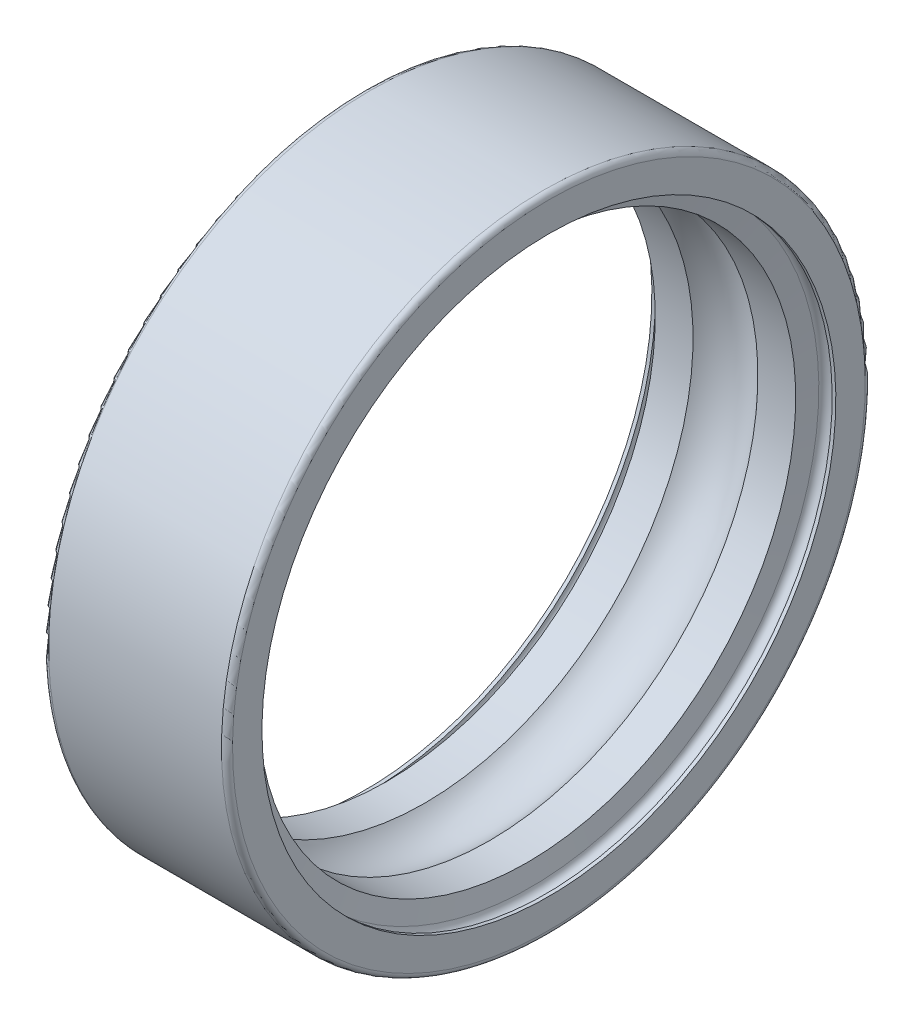
ISO-10303-21;
HEADER;
FILE_DESCRIPTION(('STEP AP214'),'2;1');
FILE_NAME('part.step','',(''),(''),'','','');
FILE_SCHEMA(('AUTOMOTIVE_DESIGN { 1 0 10303 214 1 1 1 1 }'));
ENDSEC;
DATA;
#1=APPLICATION_CONTEXT('core data for automotive mechanical design processes');
#2=APPLICATION_PROTOCOL_DEFINITION('international standard','automotive_design',2000,#1);
#3=PRODUCT_CONTEXT('',#1,'mechanical');
#4=PRODUCT('Part','Part','',(#3));
#5=PRODUCT_RELATED_PRODUCT_CATEGORY('part','',(#4));
#6=PRODUCT_DEFINITION_FORMATION('','',#4);
#7=PRODUCT_DEFINITION_CONTEXT('part definition',#1,'design');
#8=PRODUCT_DEFINITION('design','',#6,#7);
#9=PRODUCT_DEFINITION_SHAPE('','',#8);
#10=(LENGTH_UNIT() NAMED_UNIT(*) SI_UNIT(.MILLI.,.METRE.));
#11=(NAMED_UNIT(*) PLANE_ANGLE_UNIT() SI_UNIT($,.RADIAN.));
#12=(NAMED_UNIT(*) SI_UNIT($,.STERADIAN.) SOLID_ANGLE_UNIT());
#13=UNCERTAINTY_MEASURE_WITH_UNIT(LENGTH_MEASURE(1.E-05),#10,'distance_accuracy_value','');
#14=(GEOMETRIC_REPRESENTATION_CONTEXT(3) GLOBAL_UNCERTAINTY_ASSIGNED_CONTEXT((#13)) GLOBAL_UNIT_ASSIGNED_CONTEXT((#10,
#11,#12)) REPRESENTATION_CONTEXT('',''));
#15=CARTESIAN_POINT('',(0.,0.,0.));
#16=DIRECTION('',(0.,0.,1.));
#17=DIRECTION('',(1.,0.,0.));
#18=AXIS2_PLACEMENT_3D('',#15,#16,#17);
#19=CARTESIAN_POINT('',(9.4,0.,0.));
#20=DIRECTION('',(1.,0.,0.));
#21=DIRECTION('',(0.,0.,-1.));
#22=AXIS2_PLACEMENT_3D('',#19,#20,#21);
#23=TOROIDAL_SURFACE('',#22,15.6,0.4);
#24=CARTESIAN_POINT('',(9.8,0.,0.));
#25=DIRECTION('',(1.,0.,0.));
#26=DIRECTION('',(0.,1.,0.));
#27=AXIS2_PLACEMENT_3D('',#24,#25,#26);
#28=CIRCLE('',#27,15.6);
#29=CARTESIAN_POINT('',(9.8,15.6,0.));
#30=VERTEX_POINT('',#29);
#31=EDGE_CURVE('E11',#30,#30,#28,.T.);
#32=ORIENTED_EDGE('',*,*,#31,.T.);
#33=EDGE_LOOP('',(#32));
#34=FACE_BOUND('',#33,.T.);
#35=CARTESIAN_POINT('',(9.00607689879512,0.,0.));
#36=DIRECTION('',(1.,0.,0.));
#37=DIRECTION('',(0.,1.,0.));
#38=AXIS2_PLACEMENT_3D('',#35,#36,#37);
#39=CIRCLE('',#38,15.6694592710668);
#40=CARTESIAN_POINT('',(9.00607689879512,15.6694592710668,0.));
#41=VERTEX_POINT('',#40);
#42=EDGE_CURVE('E72',#41,#41,#39,.T.);
#43=ORIENTED_EDGE('',*,*,#42,.F.);
#44=EDGE_LOOP('',(#43));
#45=FACE_BOUND('',#44,.T.);
#46=ADVANCED_FACE('F17',(#34,#45),#23,.F.);
#47=CARTESIAN_POINT('',(9.9,0.,0.));
#48=DIRECTION('',(-1.,0.,0.));
#49=DIRECTION('',(0.,1.,0.));
#50=AXIS2_PLACEMENT_3D('',#47,#48,#49);
#51=CYLINDRICAL_SURFACE('',#50,15.6);
#52=CARTESIAN_POINT('',(10.,0.,0.));
#53=DIRECTION('',(1.,0.,0.));
#54=DIRECTION('',(0.,1.,0.));
#55=AXIS2_PLACEMENT_3D('',#52,#53,#54);
#56=CIRCLE('',#55,15.6);
#57=CARTESIAN_POINT('',(10.,15.6,0.));
#58=VERTEX_POINT('',#57);
#59=EDGE_CURVE('E26',#58,#58,#56,.T.);
#60=ORIENTED_EDGE('',*,*,#59,.T.);
#61=EDGE_LOOP('',(#60));
#62=FACE_BOUND('',#61,.T.);
#63=ORIENTED_EDGE('',*,*,#31,.F.);
#64=EDGE_LOOP('',(#63));
#65=FACE_BOUND('',#64,.T.);
#66=ADVANCED_FACE('F118',(#62,#65),#51,.F.);
#67=CARTESIAN_POINT('',(10.,16.4,0.));
#68=DIRECTION('',(1.,0.,0.));
#69=DIRECTION('',(0.,1.,0.));
#70=AXIS2_PLACEMENT_3D('',#67,#68,#69);
#71=PLANE('',#70);
#72=CARTESIAN_POINT('',(10.,0.,0.));
#73=DIRECTION('',(1.,0.,0.));
#74=DIRECTION('',(0.,1.,0.));
#75=AXIS2_PLACEMENT_3D('',#72,#73,#74);
#76=CIRCLE('',#75,17.2);
#77=CARTESIAN_POINT('',(10.,17.2,0.));
#78=VERTEX_POINT('',#77);
#79=EDGE_CURVE('E78',#78,#78,#76,.T.);
#80=ORIENTED_EDGE('',*,*,#79,.T.);
#81=EDGE_LOOP('',(#80));
#82=FACE_BOUND('',#81,.T.);
#83=ORIENTED_EDGE('',*,*,#59,.F.);
#84=EDGE_LOOP('',(#83));
#85=FACE_BOUND('',#84,.T.);
#86=ADVANCED_FACE('F122',(#82,#85),#71,.T.);
#87=CARTESIAN_POINT('',(9.7,0.,0.));
#88=DIRECTION('',(1.,0.,0.));
#89=DIRECTION('',(0.,0.,-1.));
#90=AXIS2_PLACEMENT_3D('',#87,#88,#89);
#91=TOROIDAL_SURFACE('',#90,17.2,0.3);
#92=CARTESIAN_POINT('',(9.7,0.,0.));
#93=DIRECTION('',(1.,0.,0.));
#94=DIRECTION('',(0.,1.,0.));
#95=AXIS2_PLACEMENT_3D('',#92,#93,#94);
#96=CIRCLE('',#95,17.5);
#97=CARTESIAN_POINT('',(9.7,17.5,0.));
#98=VERTEX_POINT('',#97);
#99=EDGE_CURVE('E80',#98,#98,#96,.T.);
#100=ORIENTED_EDGE('',*,*,#99,.T.);
#101=EDGE_LOOP('',(#100));
#102=FACE_BOUND('',#101,.T.);
#103=ORIENTED_EDGE('',*,*,#79,.F.);
#104=EDGE_LOOP('',(#103));
#105=FACE_BOUND('',#104,.T.);
#106=ADVANCED_FACE('F135',(#102,#105),#91,.T.);
#107=CARTESIAN_POINT('',(5.,0.,0.));
#108=DIRECTION('',(-1.,0.,0.));
#109=DIRECTION('',(0.,1.,0.));
#110=AXIS2_PLACEMENT_3D('',#107,#108,#109);
#111=CYLINDRICAL_SURFACE('',#110,17.5);
#112=CARTESIAN_POINT('',(0.3,0.,0.));
#113=DIRECTION('',(1.,0.,0.));
#114=DIRECTION('',(0.,1.,0.));
#115=AXIS2_PLACEMENT_3D('',#112,#113,#114);
#116=CIRCLE('',#115,17.5);
#117=CARTESIAN_POINT('',(0.3,17.5,0.));
#118=VERTEX_POINT('',#117);
#119=EDGE_CURVE('E82',#118,#118,#116,.T.);
#120=ORIENTED_EDGE('',*,*,#119,.T.);
#121=EDGE_LOOP('',(#120));
#122=FACE_BOUND('',#121,.T.);
#123=ORIENTED_EDGE('',*,*,#99,.F.);
#124=EDGE_LOOP('',(#123));
#125=FACE_BOUND('',#124,.T.);
#126=ADVANCED_FACE('F138',(#122,#125),#111,.T.);
#127=CARTESIAN_POINT('',(0.3,0.,0.));
#128=DIRECTION('',(1.,0.,0.));
#129=DIRECTION('',(0.,0.,-1.));
#130=AXIS2_PLACEMENT_3D('',#127,#128,#129);
#131=TOROIDAL_SURFACE('',#130,17.2,0.3);
#132=CARTESIAN_POINT('',(0.,0.,0.));
#133=DIRECTION('',(1.,0.,0.));
#134=DIRECTION('',(0.,1.,0.));
#135=AXIS2_PLACEMENT_3D('',#132,#133,#134);
#136=CIRCLE('',#135,17.2);
#137=CARTESIAN_POINT('',(0.,17.2,0.));
#138=VERTEX_POINT('',#137);
#139=EDGE_CURVE('E90',#138,#138,#136,.T.);
#140=ORIENTED_EDGE('',*,*,#139,.T.);
#141=EDGE_LOOP('',(#140));
#142=FACE_BOUND('',#141,.T.);
#143=ORIENTED_EDGE('',*,*,#119,.F.);
#144=EDGE_LOOP('',(#143));
#145=FACE_BOUND('',#144,.T.);
#146=ADVANCED_FACE('F147',(#142,#145),#131,.T.);
#147=CARTESIAN_POINT('',(0.,16.4,0.));
#148=DIRECTION('',(-1.,0.,0.));
#149=DIRECTION('',(0.,-1.,0.));
#150=AXIS2_PLACEMENT_3D('',#147,#148,#149);
#151=PLANE('',#150);
#152=CARTESIAN_POINT('',(0.,0.,0.));
#153=DIRECTION('',(1.,0.,0.));
#154=DIRECTION('',(0.,1.,0.));
#155=AXIS2_PLACEMENT_3D('',#152,#153,#154);
#156=CIRCLE('',#155,15.6);
#157=CARTESIAN_POINT('',(0.,15.6,0.));
#158=VERTEX_POINT('',#157);
#159=EDGE_CURVE('E85',#158,#158,#156,.T.);
#160=ORIENTED_EDGE('',*,*,#159,.T.);
#161=EDGE_LOOP('',(#160));
#162=FACE_BOUND('',#161,.T.);
#163=ORIENTED_EDGE('',*,*,#139,.F.);
#164=EDGE_LOOP('',(#163));
#165=FACE_BOUND('',#164,.T.);
#166=ADVANCED_FACE('F145',(#162,#165),#151,.T.);
#167=CARTESIAN_POINT('',(0.1,0.,0.));
#168=DIRECTION('',(-1.,0.,0.));
#169=DIRECTION('',(0.,1.,0.));
#170=AXIS2_PLACEMENT_3D('',#167,#168,#169);
#171=CYLINDRICAL_SURFACE('',#170,15.6);
#172=CARTESIAN_POINT('',(0.2,0.,0.));
#173=DIRECTION('',(1.,0.,0.));
#174=DIRECTION('',(0.,1.,0.));
#175=AXIS2_PLACEMENT_3D('',#172,#173,#174);
#176=CIRCLE('',#175,15.6);
#177=CARTESIAN_POINT('',(0.2,15.6,0.));
#178=VERTEX_POINT('',#177);
#179=EDGE_CURVE('E83',#178,#178,#176,.T.);
#180=ORIENTED_EDGE('',*,*,#179,.T.);
#181=EDGE_LOOP('',(#180));
#182=FACE_BOUND('',#181,.T.);
#183=ORIENTED_EDGE('',*,*,#159,.F.);
#184=EDGE_LOOP('',(#183));
#185=FACE_BOUND('',#184,.T.);
#186=ADVANCED_FACE('F113',(#182,#185),#171,.F.);
#187=CARTESIAN_POINT('',(0.6,0.,0.));
#188=DIRECTION('',(1.,0.,0.));
#189=DIRECTION('',(0.,0.,-1.));
#190=AXIS2_PLACEMENT_3D('',#187,#188,#189);
#191=TOROIDAL_SURFACE('',#190,15.6,0.4);
#192=CARTESIAN_POINT('',(0.993923101204883,0.,0.));
#193=DIRECTION('',(1.,0.,0.));
#194=DIRECTION('',(0.,1.,0.));
#195=AXIS2_PLACEMENT_3D('',#192,#193,#194);
#196=CIRCLE('',#195,15.6694592710668);
#197=CARTESIAN_POINT('',(0.993923101204883,15.6694592710668,0.));
#198=VERTEX_POINT('',#197);
#199=EDGE_CURVE('E20',#198,#198,#196,.T.);
#200=ORIENTED_EDGE('',*,*,#199,.T.);
#201=EDGE_LOOP('',(#200));
#202=FACE_BOUND('',#201,.T.);
#203=ORIENTED_EDGE('',*,*,#179,.F.);
#204=EDGE_LOOP('',(#203));
#205=FACE_BOUND('',#204,.T.);
#206=ADVANCED_FACE('F98',(#202,#205),#191,.F.);
#207=CARTESIAN_POINT('',(1.08821036333382,0.,0.));
#208=DIRECTION('',(-1.,0.,0.));
#209=DIRECTION('',(0.,1.,0.));
#210=AXIS2_PLACEMENT_3D('',#207,#208,#209);
#211=CONICAL_SURFACE('',#210,15.1347296355334,1.39626340159546);
#212=CARTESIAN_POINT('',(1.18249762546276,0.,0.));
#213=DIRECTION('',(1.,0.,0.));
#214=DIRECTION('',(0.,1.,0.));
#215=AXIS2_PLACEMENT_3D('',#212,#213,#214);
#216=CIRCLE('',#215,14.6);
#217=CARTESIAN_POINT('',(1.18249762546276,14.6,0.));
#218=VERTEX_POINT('',#217);
#219=EDGE_CURVE('E88',#218,#218,#216,.T.);
#220=ORIENTED_EDGE('',*,*,#219,.T.);
#221=EDGE_LOOP('',(#220));
#222=FACE_BOUND('',#221,.T.);
#223=ORIENTED_EDGE('',*,*,#199,.F.);
#224=EDGE_LOOP('',(#223));
#225=FACE_BOUND('',#224,.T.);
#226=ADVANCED_FACE('F101',(#222,#225),#211,.F.);
#227=CARTESIAN_POINT('',(2.20960815463989,0.,0.));
#228=DIRECTION('',(-1.,0.,0.));
#229=DIRECTION('',(0.,1.,0.));
#230=AXIS2_PLACEMENT_3D('',#227,#228,#229);
#231=CYLINDRICAL_SURFACE('',#230,14.6);
#232=CARTESIAN_POINT('',(3.23671868381701,0.,0.));
#233=DIRECTION('',(1.,0.,0.));
#234=DIRECTION('',(0.,1.,0.));
#235=AXIS2_PLACEMENT_3D('',#232,#233,#234);
#236=CIRCLE('',#235,14.6);
#237=CARTESIAN_POINT('',(3.23671868381701,14.6,0.));
#238=VERTEX_POINT('',#237);
#239=EDGE_CURVE('E86',#238,#238,#236,.T.);
#240=ORIENTED_EDGE('',*,*,#239,.T.);
#241=EDGE_LOOP('',(#240));
#242=FACE_BOUND('',#241,.T.);
#243=ORIENTED_EDGE('',*,*,#219,.F.);
#244=EDGE_LOOP('',(#243));
#245=FACE_BOUND('',#244,.T.);
#246=ADVANCED_FACE('F103',(#242,#245),#231,.F.);
#247=CARTESIAN_POINT('',(5.,0.,0.));
#248=DIRECTION('',(1.,0.,0.));
#249=DIRECTION('',(0.,0.,-1.));
#250=AXIS2_PLACEMENT_3D('',#247,#248,#249);
#251=TOROIDAL_SURFACE('',#250,13.,2.381);
#252=CARTESIAN_POINT('',(6.76328131618298,0.,0.));
#253=DIRECTION('',(1.,0.,0.));
#254=DIRECTION('',(0.,1.,0.));
#255=AXIS2_PLACEMENT_3D('',#252,#253,#254);
#256=CIRCLE('',#255,14.6);
#257=CARTESIAN_POINT('',(6.76328131618298,14.6,0.));
#258=VERTEX_POINT('',#257);
#259=EDGE_CURVE('E74',#258,#258,#256,.T.);
#260=ORIENTED_EDGE('',*,*,#259,.T.);
#261=EDGE_LOOP('',(#260));
#262=FACE_BOUND('',#261,.T.);
#263=ORIENTED_EDGE('',*,*,#239,.F.);
#264=EDGE_LOOP('',(#263));
#265=FACE_BOUND('',#264,.T.);
#266=ADVANCED_FACE('F110',(#262,#265),#251,.F.);
#267=CARTESIAN_POINT('',(7.79039184536011,0.,0.));
#268=DIRECTION('',(-1.,0.,0.));
#269=DIRECTION('',(0.,1.,0.));
#270=AXIS2_PLACEMENT_3D('',#267,#268,#269);
#271=CYLINDRICAL_SURFACE('',#270,14.6);
#272=CARTESIAN_POINT('',(8.81750237453724,0.,0.));
#273=DIRECTION('',(1.,0.,0.));
#274=DIRECTION('',(0.,1.,0.));
#275=AXIS2_PLACEMENT_3D('',#272,#273,#274);
#276=CIRCLE('',#275,14.6);
#277=CARTESIAN_POINT('',(8.81750237453724,14.6,0.));
#278=VERTEX_POINT('',#277);
#279=EDGE_CURVE('E68',#278,#278,#276,.T.);
#280=ORIENTED_EDGE('',*,*,#279,.T.);
#281=EDGE_LOOP('',(#280));
#282=FACE_BOUND('',#281,.T.);
#283=ORIENTED_EDGE('',*,*,#259,.F.);
#284=EDGE_LOOP('',(#283));
#285=FACE_BOUND('',#284,.T.);
#286=ADVANCED_FACE('F69',(#282,#285),#271,.F.);
#287=CARTESIAN_POINT('',(8.91178963666618,0.,0.));
#288=DIRECTION('',(1.,0.,0.));
#289=DIRECTION('',(0.,1.,0.));
#290=AXIS2_PLACEMENT_3D('',#287,#288,#289);
#291=CONICAL_SURFACE('',#290,15.1347296355334,1.39626340159546);
#292=ORIENTED_EDGE('',*,*,#42,.T.);
#293=EDGE_LOOP('',(#292));
#294=FACE_BOUND('',#293,.T.);
#295=ORIENTED_EDGE('',*,*,#279,.F.);
#296=EDGE_LOOP('',(#295));
#297=FACE_BOUND('',#296,.T.);
#298=ADVANCED_FACE('F128',(#294,#297),#291,.F.);
#299=CLOSED_SHELL('',(#46,#66,#86,#106,#126,#146,#166,#186,#206,#226,#246,#266,#286,#298));
#300=MANIFOLD_SOLID_BREP('B1',#299);
#301=ADVANCED_BREP_SHAPE_REPRESENTATION('',(#18,#300),#14);
#302=SHAPE_DEFINITION_REPRESENTATION(#9,#301);
ENDSEC;
END-ISO-10303-21;
